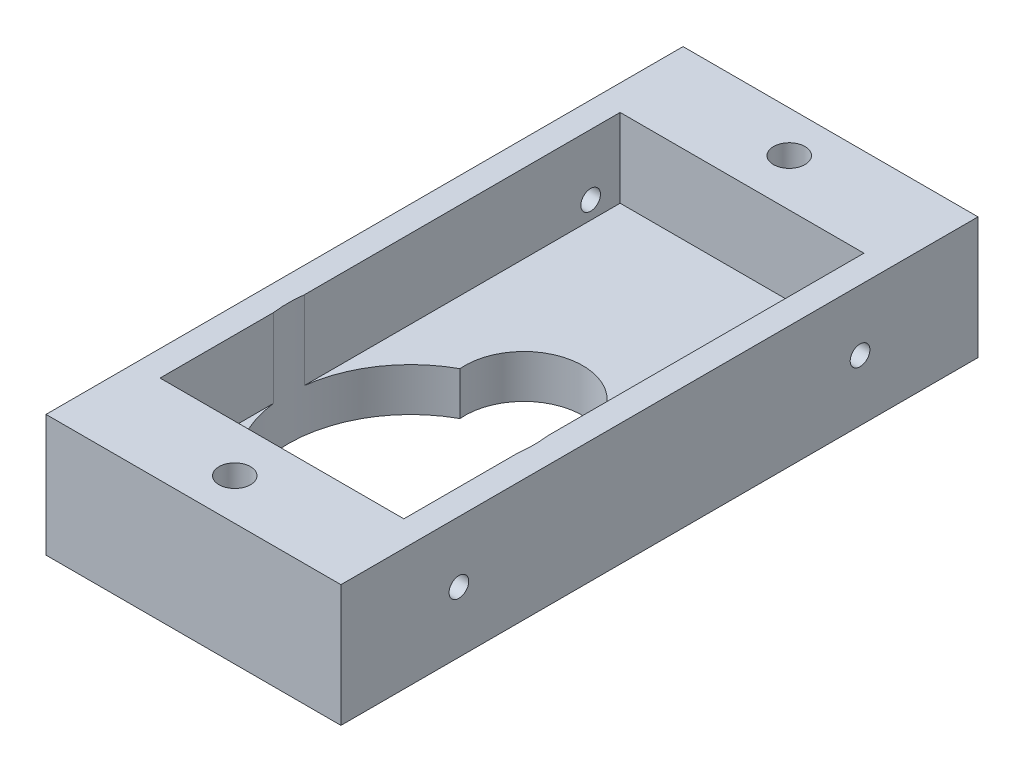
ISO-10303-21;
HEADER;
FILE_DESCRIPTION(('STEP AP214'),'2;1');
FILE_NAME('part.step','',(''),(''),'','','');
FILE_SCHEMA(('AUTOMOTIVE_DESIGN { 1 0 10303 214 1 1 1 1 }'));
ENDSEC;
DATA;
#1=APPLICATION_CONTEXT('core data for automotive mechanical design processes');
#2=APPLICATION_PROTOCOL_DEFINITION('international standard','automotive_design',2000,#1);
#3=PRODUCT_CONTEXT('',#1,'mechanical');
#4=PRODUCT('Part','Part','',(#3));
#5=PRODUCT_RELATED_PRODUCT_CATEGORY('part','',(#4));
#6=PRODUCT_DEFINITION_FORMATION('','',#4);
#7=PRODUCT_DEFINITION_CONTEXT('part definition',#1,'design');
#8=PRODUCT_DEFINITION('design','',#6,#7);
#9=PRODUCT_DEFINITION_SHAPE('','',#8);
#10=(LENGTH_UNIT() NAMED_UNIT(*) SI_UNIT(.MILLI.,.METRE.));
#11=(NAMED_UNIT(*) PLANE_ANGLE_UNIT() SI_UNIT($,.RADIAN.));
#12=(NAMED_UNIT(*) SI_UNIT($,.STERADIAN.) SOLID_ANGLE_UNIT());
#13=UNCERTAINTY_MEASURE_WITH_UNIT(LENGTH_MEASURE(1.E-05),#10,'distance_accuracy_value','');
#14=(GEOMETRIC_REPRESENTATION_CONTEXT(3) GLOBAL_UNCERTAINTY_ASSIGNED_CONTEXT((#13)) GLOBAL_UNIT_ASSIGNED_CONTEXT((#10,
#11,#12)) REPRESENTATION_CONTEXT('',''));
#15=CARTESIAN_POINT('',(0.,0.,0.));
#16=DIRECTION('',(0.,0.,1.));
#17=DIRECTION('',(1.,0.,0.));
#18=AXIS2_PLACEMENT_3D('',#15,#16,#17);
#19=CARTESIAN_POINT('',(0.,2.2,0.));
#20=DIRECTION('',(0.,-1.,0.));
#21=DIRECTION('',(0.,0.,-1.));
#22=AXIS2_PLACEMENT_3D('',#19,#20,#21);
#23=PLANE('',#22);
#24=CARTESIAN_POINT('',(7.5,2.2,21.35));
#25=DIRECTION('',(0.,1.,0.));
#26=DIRECTION('',(0.,0.,1.));
#27=AXIS2_PLACEMENT_3D('',#24,#25,#26);
#28=CIRCLE('',#27,6.25);
#29=CARTESIAN_POINT('',(13.7,2.2,20.561013308097));
#30=VERTEX_POINT('',#29);
#31=CARTESIAN_POINT('',(10.4886363227973,2.2,15.8608695652174));
#32=VERTEX_POINT('',#31);
#33=EDGE_CURVE('E295',#30,#32,#28,.T.);
#34=ORIENTED_EDGE('',*,*,#33,.F.);
#35=DIRECTION('',(0.,0.,-1.));
#36=VECTOR('',#35,1.);
#37=CARTESIAN_POINT('',(13.7,2.2,0.));
#38=LINE('',#37,#36);
#39=CARTESIAN_POINT('',(13.7,2.2,4.5));
#40=VERTEX_POINT('',#39);
#41=EDGE_CURVE('E234',#30,#40,#38,.T.);
#42=ORIENTED_EDGE('',*,*,#41,.T.);
#43=DIRECTION('',(-1.,0.,0.));
#44=VECTOR('',#43,1.);
#45=CARTESIAN_POINT('',(0.,2.2,4.50000000000001));
#46=LINE('',#45,#44);
#47=CARTESIAN_POINT('',(1.3,2.2,4.50000000000001));
#48=VERTEX_POINT('',#47);
#49=EDGE_CURVE('E265',#40,#48,#46,.T.);
#50=ORIENTED_EDGE('',*,*,#49,.T.);
#51=DIRECTION('',(0.,0.,1.));
#52=VECTOR('',#51,1.);
#53=CARTESIAN_POINT('',(1.3,2.2,0.));
#54=LINE('',#53,#52);
#55=CARTESIAN_POINT('',(1.3,2.2,20.561013308097));
#56=VERTEX_POINT('',#55);
#57=EDGE_CURVE('E264',#48,#56,#54,.T.);
#58=ORIENTED_EDGE('',*,*,#57,.T.);
#59=CARTESIAN_POINT('',(4.5113636772027,2.2,15.8608695652174));
#60=VERTEX_POINT('',#59);
#61=EDGE_CURVE('E291',#60,#56,#28,.T.);
#62=ORIENTED_EDGE('',*,*,#61,.F.);
#63=CARTESIAN_POINT('',(7.49999999999999,2.2,15.6));
#64=DIRECTION('',(0.,1.,0.));
#65=DIRECTION('',(0.,0.,1.));
#66=AXIS2_PLACEMENT_3D('',#63,#64,#65);
#67=CIRCLE('',#66,3.);
#68=EDGE_CURVE('E128',#32,#60,#67,.T.);
#69=ORIENTED_EDGE('',*,*,#68,.F.);
#70=EDGE_LOOP('',(#34,#42,#50,#58,#62,#69));
#71=FACE_BOUND('',#70,.T.);
#72=ADVANCED_FACE('F103',(#71),#23,.F.);
#73=DIRECTION('',(-1.,0.,0.));
#74=VECTOR('',#73,1.);
#75=CARTESIAN_POINT('',(0.,2.2,27.9));
#76=LINE('',#75,#74);
#77=CARTESIAN_POINT('',(13.7,2.2,27.9));
#78=VERTEX_POINT('',#77);
#79=CARTESIAN_POINT('',(1.3,2.2,27.9));
#80=VERTEX_POINT('',#79);
#81=EDGE_CURVE('E120',#78,#80,#76,.T.);
#82=ORIENTED_EDGE('',*,*,#81,.F.);
#83=CARTESIAN_POINT('',(13.7,2.2,22.138986691903));
#84=VERTEX_POINT('',#83);
#85=EDGE_CURVE('E231',#78,#84,#38,.T.);
#86=ORIENTED_EDGE('',*,*,#85,.T.);
#87=CARTESIAN_POINT('',(1.3,2.2,22.138986691903));
#88=VERTEX_POINT('',#87);
#89=EDGE_CURVE('E294',#88,#84,#28,.T.);
#90=ORIENTED_EDGE('',*,*,#89,.F.);
#91=EDGE_CURVE('E260',#88,#80,#54,.T.);
#92=ORIENTED_EDGE('',*,*,#91,.T.);
#93=EDGE_LOOP('',(#82,#86,#90,#92));
#94=FACE_BOUND('',#93,.T.);
#95=ADVANCED_FACE('F390',(#94),#23,.F.);
#96=CARTESIAN_POINT('',(0.,0.,0.));
#97=DIRECTION('',(0.,-1.,0.));
#98=DIRECTION('',(0.,0.,-1.));
#99=AXIS2_PLACEMENT_3D('',#96,#97,#98);
#100=PLANE('',#99);
#101=CARTESIAN_POINT('',(7.5,0.,21.35));
#102=DIRECTION('',(0.,1.,0.));
#103=DIRECTION('',(0.,0.,1.));
#104=AXIS2_PLACEMENT_3D('',#101,#102,#103);
#105=CIRCLE('',#104,6.25);
#106=CARTESIAN_POINT('',(4.5113636772027,0.,15.8608695652174));
#107=VERTEX_POINT('',#106);
#108=CARTESIAN_POINT('',(10.4886363227973,0.,15.8608695652174));
#109=VERTEX_POINT('',#108);
#110=EDGE_CURVE('E296',#107,#109,#105,.T.);
#111=ORIENTED_EDGE('',*,*,#110,.T.);
#112=CARTESIAN_POINT('',(7.49999999999999,0.,15.6));
#113=DIRECTION('',(0.,1.,0.));
#114=DIRECTION('',(0.,0.,1.));
#115=AXIS2_PLACEMENT_3D('',#112,#113,#114);
#116=CIRCLE('',#115,3.);
#117=EDGE_CURVE('E288',#109,#107,#116,.T.);
#118=ORIENTED_EDGE('',*,*,#117,.T.);
#119=EDGE_LOOP('',(#111,#118));
#120=FACE_BOUND('',#119,.T.);
#121=CARTESIAN_POINT('',(3.,0.,3.));
#122=DIRECTION('',(0.,1.,0.));
#123=DIRECTION('',(0.,0.,1.));
#124=AXIS2_PLACEMENT_3D('',#121,#122,#123);
#125=CIRCLE('',#124,0.8);
#126=CARTESIAN_POINT('',(3.,0.,3.8));
#127=VERTEX_POINT('',#126);
#128=EDGE_CURVE('E309',#127,#127,#125,.T.);
#129=ORIENTED_EDGE('',*,*,#128,.T.);
#130=EDGE_LOOP('',(#129));
#131=FACE_BOUND('',#130,.T.);
#132=CARTESIAN_POINT('',(12.,0.,29.4));
#133=DIRECTION('',(0.,1.,0.));
#134=DIRECTION('',(0.,0.,1.));
#135=AXIS2_PLACEMENT_3D('',#132,#133,#134);
#136=CIRCLE('',#135,0.8);
#137=CARTESIAN_POINT('',(12.,0.,30.2));
#138=VERTEX_POINT('',#137);
#139=EDGE_CURVE('E320',#138,#138,#136,.T.);
#140=ORIENTED_EDGE('',*,*,#139,.T.);
#141=EDGE_LOOP('',(#140));
#142=FACE_BOUND('',#141,.T.);
#143=DIRECTION('',(1.,0.,0.));
#144=VECTOR('',#143,1.);
#145=CARTESIAN_POINT('',(0.,0.,0.));
#146=LINE('',#145,#144);
#147=CARTESIAN_POINT('',(0.,0.,0.));
#148=VERTEX_POINT('',#147);
#149=CARTESIAN_POINT('',(15.,0.,0.));
#150=VERTEX_POINT('',#149);
#151=EDGE_CURVE('E325',#148,#150,#146,.T.);
#152=ORIENTED_EDGE('',*,*,#151,.T.);
#153=DIRECTION('',(0.,0.,1.));
#154=VECTOR('',#153,1.);
#155=CARTESIAN_POINT('',(15.,0.,0.));
#156=LINE('',#155,#154);
#157=CARTESIAN_POINT('',(15.,0.,32.4));
#158=VERTEX_POINT('',#157);
#159=EDGE_CURVE('E328',#150,#158,#156,.T.);
#160=ORIENTED_EDGE('',*,*,#159,.T.);
#161=DIRECTION('',(1.,0.,0.));
#162=VECTOR('',#161,1.);
#163=CARTESIAN_POINT('',(0.,0.,32.4));
#164=LINE('',#163,#162);
#165=CARTESIAN_POINT('',(0.,0.,32.4));
#166=VERTEX_POINT('',#165);
#167=EDGE_CURVE('E331',#166,#158,#164,.T.);
#168=ORIENTED_EDGE('',*,*,#167,.F.);
#169=DIRECTION('',(0.,0.,1.));
#170=VECTOR('',#169,1.);
#171=CARTESIAN_POINT('',(0.,0.,0.));
#172=LINE('',#171,#170);
#173=EDGE_CURVE('E212',#148,#166,#172,.T.);
#174=ORIENTED_EDGE('',*,*,#173,.F.);
#175=EDGE_LOOP('',(#152,#160,#168,#174));
#176=FACE_BOUND('',#175,.T.);
#177=CARTESIAN_POINT('',(3.,0.,29.4));
#178=DIRECTION('',(0.,1.,0.));
#179=DIRECTION('',(0.,0.,1.));
#180=AXIS2_PLACEMENT_3D('',#177,#178,#179);
#181=CIRCLE('',#180,0.799999999999999);
#182=CARTESIAN_POINT('',(3.,0.,30.2));
#183=VERTEX_POINT('',#182);
#184=EDGE_CURVE('E315',#183,#183,#181,.T.);
#185=ORIENTED_EDGE('',*,*,#184,.T.);
#186=EDGE_LOOP('',(#185));
#187=FACE_BOUND('',#186,.T.);
#188=CARTESIAN_POINT('',(12.,0.,3.));
#189=DIRECTION('',(0.,1.,0.));
#190=DIRECTION('',(0.,0.,1.));
#191=AXIS2_PLACEMENT_3D('',#188,#189,#190);
#192=CIRCLE('',#191,0.800000000000001);
#193=CARTESIAN_POINT('',(12.,0.,3.8));
#194=VERTEX_POINT('',#193);
#195=EDGE_CURVE('E303',#194,#194,#192,.T.);
#196=ORIENTED_EDGE('',*,*,#195,.T.);
#197=EDGE_LOOP('',(#196));
#198=FACE_BOUND('',#197,.T.);
#199=ADVANCED_FACE('F396',(#120,#131,#142,#176,#187,#198),#100,.T.);
#200=CARTESIAN_POINT('',(0.,2.2,0.));
#201=DIRECTION('',(0.,0.,-1.));
#202=DIRECTION('',(-1.,0.,0.));
#203=AXIS2_PLACEMENT_3D('',#200,#201,#202);
#204=PLANE('',#203);
#205=ORIENTED_EDGE('',*,*,#151,.F.);
#206=DIRECTION('',(0.,-1.,0.));
#207=VECTOR('',#206,1.);
#208=CARTESIAN_POINT('',(0.,2.2,0.));
#209=LINE('',#208,#207);
#210=CARTESIAN_POINT('',(0.,6.2,0.));
#211=VERTEX_POINT('',#210);
#212=EDGE_CURVE('E12',#211,#148,#209,.T.);
#213=ORIENTED_EDGE('',*,*,#212,.F.);
#214=DIRECTION('',(-1.,0.,0.));
#215=VECTOR('',#214,1.);
#216=CARTESIAN_POINT('',(0.,6.2,0.));
#217=LINE('',#216,#215);
#218=CARTESIAN_POINT('',(15.,6.2,0.));
#219=VERTEX_POINT('',#218);
#220=EDGE_CURVE('E230',#219,#211,#217,.T.);
#221=ORIENTED_EDGE('',*,*,#220,.F.);
#222=DIRECTION('',(0.,-1.,0.));
#223=VECTOR('',#222,1.);
#224=CARTESIAN_POINT('',(15.,2.2,0.));
#225=LINE('',#224,#223);
#226=EDGE_CURVE('E333',#219,#150,#225,.T.);
#227=ORIENTED_EDGE('',*,*,#226,.T.);
#228=EDGE_LOOP('',(#205,#213,#221,#227));
#229=FACE_BOUND('',#228,.T.);
#230=ADVANCED_FACE('F105',(#229),#204,.T.);
#231=CARTESIAN_POINT('',(0.,2.2,0.));
#232=DIRECTION('',(1.,0.,0.));
#233=DIRECTION('',(0.,0.,-1.));
#234=AXIS2_PLACEMENT_3D('',#231,#232,#233);
#235=PLANE('',#234);
#236=CARTESIAN_POINT('',(0.,3.1,26.4));
#237=DIRECTION('',(-1.,0.,0.));
#238=DIRECTION('',(0.,0.,1.));
#239=AXIS2_PLACEMENT_3D('',#236,#237,#238);
#240=CIRCLE('',#239,0.499999999999999);
#241=CARTESIAN_POINT('',(0.,3.1,26.9));
#242=VERTEX_POINT('',#241);
#243=EDGE_CURVE('E345',#242,#242,#240,.T.);
#244=ORIENTED_EDGE('',*,*,#243,.F.);
#245=EDGE_LOOP('',(#244));
#246=FACE_BOUND('',#245,.T.);
#247=CARTESIAN_POINT('',(0.,3.1,6.));
#248=DIRECTION('',(-1.,0.,0.));
#249=DIRECTION('',(0.,0.,1.));
#250=AXIS2_PLACEMENT_3D('',#247,#248,#249);
#251=CIRCLE('',#250,0.500000000000001);
#252=CARTESIAN_POINT('',(0.,3.1,6.5));
#253=VERTEX_POINT('',#252);
#254=EDGE_CURVE('E350',#253,#253,#251,.T.);
#255=ORIENTED_EDGE('',*,*,#254,.F.);
#256=EDGE_LOOP('',(#255));
#257=FACE_BOUND('',#256,.T.);
#258=ORIENTED_EDGE('',*,*,#173,.T.);
#259=DIRECTION('',(0.,-1.,0.));
#260=VECTOR('',#259,1.);
#261=CARTESIAN_POINT('',(0.,2.2,32.4));
#262=LINE('',#261,#260);
#263=CARTESIAN_POINT('',(0.,6.2,32.4));
#264=VERTEX_POINT('',#263);
#265=EDGE_CURVE('E112',#264,#166,#262,.T.);
#266=ORIENTED_EDGE('',*,*,#265,.F.);
#267=DIRECTION('',(0.,0.,1.));
#268=VECTOR('',#267,1.);
#269=CARTESIAN_POINT('',(0.,6.2,0.));
#270=LINE('',#269,#268);
#271=EDGE_CURVE('E210',#211,#264,#270,.T.);
#272=ORIENTED_EDGE('',*,*,#271,.F.);
#273=ORIENTED_EDGE('',*,*,#212,.T.);
#274=EDGE_LOOP('',(#258,#266,#272,#273));
#275=FACE_BOUND('',#274,.T.);
#276=ADVANCED_FACE('F208',(#246,#257,#275),#235,.F.);
#277=CARTESIAN_POINT('',(0.,2.2,32.4));
#278=DIRECTION('',(0.,0.,-1.));
#279=DIRECTION('',(-1.,0.,0.));
#280=AXIS2_PLACEMENT_3D('',#277,#278,#279);
#281=PLANE('',#280);
#282=ORIENTED_EDGE('',*,*,#167,.T.);
#283=DIRECTION('',(0.,-1.,0.));
#284=VECTOR('',#283,1.);
#285=CARTESIAN_POINT('',(15.,2.2,32.4));
#286=LINE('',#285,#284);
#287=CARTESIAN_POINT('',(15.,6.2,32.4));
#288=VERTEX_POINT('',#287);
#289=EDGE_CURVE('E216',#288,#158,#286,.T.);
#290=ORIENTED_EDGE('',*,*,#289,.F.);
#291=DIRECTION('',(1.,0.,0.));
#292=VECTOR('',#291,1.);
#293=CARTESIAN_POINT('',(0.,6.2,32.4));
#294=LINE('',#293,#292);
#295=EDGE_CURVE('E219',#264,#288,#294,.T.);
#296=ORIENTED_EDGE('',*,*,#295,.F.);
#297=ORIENTED_EDGE('',*,*,#265,.T.);
#298=EDGE_LOOP('',(#282,#290,#296,#297));
#299=FACE_BOUND('',#298,.T.);
#300=ADVANCED_FACE('F220',(#299),#281,.F.);
#301=CARTESIAN_POINT('',(15.,2.2,0.));
#302=DIRECTION('',(1.,0.,0.));
#303=DIRECTION('',(0.,0.,-1.));
#304=AXIS2_PLACEMENT_3D('',#301,#302,#303);
#305=PLANE('',#304);
#306=CARTESIAN_POINT('',(15.,3.1,26.4));
#307=DIRECTION('',(-1.,0.,0.));
#308=DIRECTION('',(0.,0.,1.));
#309=AXIS2_PLACEMENT_3D('',#306,#307,#308);
#310=CIRCLE('',#309,0.499999999999999);
#311=CARTESIAN_POINT('',(15.,3.1,26.9));
#312=VERTEX_POINT('',#311);
#313=EDGE_CURVE('E339',#312,#312,#310,.T.);
#314=ORIENTED_EDGE('',*,*,#313,.T.);
#315=EDGE_LOOP('',(#314));
#316=FACE_BOUND('',#315,.T.);
#317=CARTESIAN_POINT('',(15.,3.1,6.));
#318=DIRECTION('',(-1.,0.,0.));
#319=DIRECTION('',(0.,0.,1.));
#320=AXIS2_PLACEMENT_3D('',#317,#318,#319);
#321=CIRCLE('',#320,0.500000000000001);
#322=CARTESIAN_POINT('',(15.,3.1,6.5));
#323=VERTEX_POINT('',#322);
#324=EDGE_CURVE('E355',#323,#323,#321,.T.);
#325=ORIENTED_EDGE('',*,*,#324,.T.);
#326=EDGE_LOOP('',(#325));
#327=FACE_BOUND('',#326,.T.);
#328=ORIENTED_EDGE('',*,*,#159,.F.);
#329=ORIENTED_EDGE('',*,*,#226,.F.);
#330=DIRECTION('',(0.,0.,-1.));
#331=VECTOR('',#330,1.);
#332=CARTESIAN_POINT('',(15.,6.2,0.));
#333=LINE('',#332,#331);
#334=EDGE_CURVE('E224',#288,#219,#333,.T.);
#335=ORIENTED_EDGE('',*,*,#334,.F.);
#336=ORIENTED_EDGE('',*,*,#289,.T.);
#337=EDGE_LOOP('',(#328,#329,#335,#336));
#338=FACE_BOUND('',#337,.T.);
#339=ADVANCED_FACE('F410',(#316,#327,#338),#305,.T.);
#340=CARTESIAN_POINT('',(12.,2.2,29.4));
#341=DIRECTION('',(0.,-1.,0.));
#342=DIRECTION('',(0.,0.,-1.));
#343=AXIS2_PLACEMENT_3D('',#340,#341,#342);
#344=CYLINDRICAL_SURFACE('',#343,0.8);
#345=CARTESIAN_POINT('',(12.,2.2,29.4));
#346=DIRECTION('',(0.,1.,0.));
#347=DIRECTION('',(0.,0.,1.));
#348=AXIS2_PLACEMENT_3D('',#345,#346,#347);
#349=CIRCLE('',#348,0.8);
#350=CARTESIAN_POINT('',(12.,2.2,30.2));
#351=VERTEX_POINT('',#350);
#352=EDGE_CURVE('E299',#351,#351,#349,.T.);
#353=ORIENTED_EDGE('',*,*,#352,.T.);
#354=EDGE_LOOP('',(#353));
#355=FACE_BOUND('',#354,.T.);
#356=ORIENTED_EDGE('',*,*,#139,.F.);
#357=EDGE_LOOP('',(#356));
#358=FACE_BOUND('',#357,.T.);
#359=ADVANCED_FACE('F401',(#355,#358),#344,.F.);
#360=CARTESIAN_POINT('',(3.,2.2,29.4));
#361=DIRECTION('',(0.,-1.,0.));
#362=DIRECTION('',(0.,0.,-1.));
#363=AXIS2_PLACEMENT_3D('',#360,#361,#362);
#364=CYLINDRICAL_SURFACE('',#363,0.799999999999999);
#365=CARTESIAN_POINT('',(3.,2.2,29.4));
#366=DIRECTION('',(0.,1.,0.));
#367=DIRECTION('',(0.,0.,1.));
#368=AXIS2_PLACEMENT_3D('',#365,#366,#367);
#369=CIRCLE('',#368,0.799999999999999);
#370=CARTESIAN_POINT('',(3.,2.2,30.2));
#371=VERTEX_POINT('',#370);
#372=EDGE_CURVE('E312',#371,#371,#369,.T.);
#373=ORIENTED_EDGE('',*,*,#372,.T.);
#374=EDGE_LOOP('',(#373));
#375=FACE_BOUND('',#374,.T.);
#376=ORIENTED_EDGE('',*,*,#184,.F.);
#377=EDGE_LOOP('',(#376));
#378=FACE_BOUND('',#377,.T.);
#379=ADVANCED_FACE('F415',(#375,#378),#364,.F.);
#380=CARTESIAN_POINT('',(3.,2.2,3.));
#381=DIRECTION('',(0.,-1.,0.));
#382=DIRECTION('',(0.,0.,-1.));
#383=AXIS2_PLACEMENT_3D('',#380,#381,#382);
#384=CYLINDRICAL_SURFACE('',#383,0.8);
#385=CARTESIAN_POINT('',(3.,2.2,3.));
#386=DIRECTION('',(0.,1.,0.));
#387=DIRECTION('',(0.,0.,1.));
#388=AXIS2_PLACEMENT_3D('',#385,#386,#387);
#389=CIRCLE('',#388,0.8);
#390=CARTESIAN_POINT('',(3.,2.2,3.8));
#391=VERTEX_POINT('',#390);
#392=EDGE_CURVE('E306',#391,#391,#389,.T.);
#393=ORIENTED_EDGE('',*,*,#392,.T.);
#394=EDGE_LOOP('',(#393));
#395=FACE_BOUND('',#394,.T.);
#396=ORIENTED_EDGE('',*,*,#128,.F.);
#397=EDGE_LOOP('',(#396));
#398=FACE_BOUND('',#397,.T.);
#399=ADVANCED_FACE('F638',(#395,#398),#384,.F.);
#400=CARTESIAN_POINT('',(12.,2.2,3.));
#401=DIRECTION('',(0.,-1.,0.));
#402=DIRECTION('',(0.,0.,-1.));
#403=AXIS2_PLACEMENT_3D('',#400,#401,#402);
#404=CYLINDRICAL_SURFACE('',#403,0.800000000000001);
#405=CARTESIAN_POINT('',(12.,2.2,3.));
#406=DIRECTION('',(0.,1.,0.));
#407=DIRECTION('',(0.,0.,1.));
#408=AXIS2_PLACEMENT_3D('',#405,#406,#407);
#409=CIRCLE('',#408,0.800000000000001);
#410=CARTESIAN_POINT('',(12.,2.2,3.8));
#411=VERTEX_POINT('',#410);
#412=EDGE_CURVE('E285',#411,#411,#409,.T.);
#413=ORIENTED_EDGE('',*,*,#412,.T.);
#414=EDGE_LOOP('',(#413));
#415=FACE_BOUND('',#414,.T.);
#416=ORIENTED_EDGE('',*,*,#195,.F.);
#417=EDGE_LOOP('',(#416));
#418=FACE_BOUND('',#417,.T.);
#419=ADVANCED_FACE('F640',(#415,#418),#404,.F.);
#420=CARTESIAN_POINT('',(7.49999999999999,2.2,15.6));
#421=DIRECTION('',(0.,-1.,0.));
#422=DIRECTION('',(0.,0.,-1.));
#423=AXIS2_PLACEMENT_3D('',#420,#421,#422);
#424=CYLINDRICAL_SURFACE('',#423,3.);
#425=DIRECTION('',(0.,-1.,0.));
#426=VECTOR('',#425,1.);
#427=CARTESIAN_POINT('',(4.5113636772027,1.1,15.8608695652174));
#428=LINE('',#427,#426);
#429=EDGE_CURVE('E301',#60,#107,#428,.T.);
#430=ORIENTED_EDGE('',*,*,#429,.T.);
#431=ORIENTED_EDGE('',*,*,#117,.F.);
#432=DIRECTION('',(0.,-1.,0.));
#433=VECTOR('',#432,1.);
#434=CARTESIAN_POINT('',(10.4886363227973,1.1,15.8608695652174));
#435=LINE('',#434,#433);
#436=EDGE_CURVE('E287',#109,#32,#435,.F.);
#437=ORIENTED_EDGE('',*,*,#436,.T.);
#438=ORIENTED_EDGE('',*,*,#68,.T.);
#439=EDGE_LOOP('',(#430,#431,#437,#438));
#440=FACE_BOUND('',#439,.T.);
#441=ADVANCED_FACE('F452',(#440),#424,.F.);
#442=CARTESIAN_POINT('',(7.5,2.2,21.35));
#443=DIRECTION('',(0.,-1.,0.));
#444=DIRECTION('',(0.,0.,-1.));
#445=AXIS2_PLACEMENT_3D('',#442,#443,#444);
#446=CYLINDRICAL_SURFACE('',#445,6.25);
#447=ORIENTED_EDGE('',*,*,#61,.T.);
#448=DIRECTION('',(0.,-1.,0.));
#449=VECTOR('',#448,1.);
#450=CARTESIAN_POINT('',(1.3,6.2,20.561013308097));
#451=LINE('',#450,#449);
#452=CARTESIAN_POINT('',(1.3,6.2,20.561013308097));
#453=VERTEX_POINT('',#452);
#454=EDGE_CURVE('E279',#453,#56,#451,.T.);
#455=ORIENTED_EDGE('',*,*,#454,.F.);
#456=CARTESIAN_POINT('',(7.5,6.2,21.35));
#457=DIRECTION('',(0.,1.,0.));
#458=DIRECTION('',(0.,0.,1.));
#459=AXIS2_PLACEMENT_3D('',#456,#457,#458);
#460=CIRCLE('',#459,6.25);
#461=CARTESIAN_POINT('',(1.3,6.2,22.138986691903));
#462=VERTEX_POINT('',#461);
#463=EDGE_CURVE('E247',#462,#453,#460,.F.);
#464=ORIENTED_EDGE('',*,*,#463,.F.);
#465=DIRECTION('',(0.,-1.,0.));
#466=VECTOR('',#465,1.);
#467=CARTESIAN_POINT('',(1.3,6.2,22.138986691903));
#468=LINE('',#467,#466);
#469=EDGE_CURVE('E281',#462,#88,#468,.T.);
#470=ORIENTED_EDGE('',*,*,#469,.T.);
#471=ORIENTED_EDGE('',*,*,#89,.T.);
#472=DIRECTION('',(0.,-1.,0.));
#473=VECTOR('',#472,1.);
#474=CARTESIAN_POINT('',(13.7,6.2,22.138986691903));
#475=LINE('',#474,#473);
#476=CARTESIAN_POINT('',(13.7,6.2,22.138986691903));
#477=VERTEX_POINT('',#476);
#478=EDGE_CURVE('E271',#477,#84,#475,.T.);
#479=ORIENTED_EDGE('',*,*,#478,.F.);
#480=CARTESIAN_POINT('',(7.5,6.2,21.35));
#481=DIRECTION('',(0.,1.,0.));
#482=DIRECTION('',(0.,0.,1.));
#483=AXIS2_PLACEMENT_3D('',#480,#481,#482);
#484=CIRCLE('',#483,6.25);
#485=CARTESIAN_POINT('',(13.7,6.2,20.561013308097));
#486=VERTEX_POINT('',#485);
#487=EDGE_CURVE('E256',#486,#477,#484,.F.);
#488=ORIENTED_EDGE('',*,*,#487,.F.);
#489=DIRECTION('',(0.,-1.,0.));
#490=VECTOR('',#489,1.);
#491=CARTESIAN_POINT('',(13.7,6.2,20.561013308097));
#492=LINE('',#491,#490);
#493=EDGE_CURVE('E273',#486,#30,#492,.T.);
#494=ORIENTED_EDGE('',*,*,#493,.T.);
#495=ORIENTED_EDGE('',*,*,#33,.T.);
#496=ORIENTED_EDGE('',*,*,#436,.F.);
#497=ORIENTED_EDGE('',*,*,#110,.F.);
#498=ORIENTED_EDGE('',*,*,#429,.F.);
#499=EDGE_LOOP('',(#447,#455,#464,#470,#471,#479,#488,#494,#495,#496,#497,#498));
#500=FACE_BOUND('',#499,.T.);
#501=ADVANCED_FACE('F447',(#500),#446,.F.);
#502=CARTESIAN_POINT('',(0.,6.2,0.));
#503=DIRECTION('',(0.,1.,0.));
#504=DIRECTION('',(0.,0.,1.));
#505=AXIS2_PLACEMENT_3D('',#502,#503,#504);
#506=PLANE('',#505);
#507=CARTESIAN_POINT('',(7.50000000000002,6.2,2.1));
#508=DIRECTION('',(0.,1.,0.));
#509=DIRECTION('',(-1.,0.,0.));
#510=AXIS2_PLACEMENT_3D('',#507,#508,#509);
#511=CIRCLE('',#510,0.800000000000001);
#512=CARTESIAN_POINT('',(6.70000000000002,6.2,2.1));
#513=VERTEX_POINT('',#512);
#514=EDGE_CURVE('E363',#513,#513,#511,.T.);
#515=ORIENTED_EDGE('',*,*,#514,.F.);
#516=EDGE_LOOP('',(#515));
#517=FACE_BOUND('',#516,.T.);
#518=CARTESIAN_POINT('',(7.50000000000002,6.2,30.3));
#519=DIRECTION('',(0.,1.,0.));
#520=DIRECTION('',(-1.,0.,0.));
#521=AXIS2_PLACEMENT_3D('',#518,#519,#520);
#522=CIRCLE('',#521,0.8);
#523=CARTESIAN_POINT('',(6.70000000000002,6.2,30.3));
#524=VERTEX_POINT('',#523);
#525=EDGE_CURVE('E365',#524,#524,#522,.T.);
#526=ORIENTED_EDGE('',*,*,#525,.F.);
#527=EDGE_LOOP('',(#526));
#528=FACE_BOUND('',#527,.T.);
#529=ORIENTED_EDGE('',*,*,#271,.T.);
#530=ORIENTED_EDGE('',*,*,#295,.T.);
#531=ORIENTED_EDGE('',*,*,#334,.T.);
#532=ORIENTED_EDGE('',*,*,#220,.T.);
#533=EDGE_LOOP('',(#529,#530,#531,#532));
#534=FACE_BOUND('',#533,.T.);
#535=DIRECTION('',(-1.,0.,0.));
#536=VECTOR('',#535,1.);
#537=CARTESIAN_POINT('',(0.,6.2,27.9));
#538=LINE('',#537,#536);
#539=CARTESIAN_POINT('',(13.7,6.2,27.9));
#540=VERTEX_POINT('',#539);
#541=CARTESIAN_POINT('',(1.3,6.2,27.9));
#542=VERTEX_POINT('',#541);
#543=EDGE_CURVE('E242',#540,#542,#538,.T.);
#544=ORIENTED_EDGE('',*,*,#543,.T.);
#545=DIRECTION('',(0.,0.,1.));
#546=VECTOR('',#545,1.);
#547=CARTESIAN_POINT('',(1.3,6.2,0.));
#548=LINE('',#547,#546);
#549=EDGE_CURVE('E244',#462,#542,#548,.T.);
#550=ORIENTED_EDGE('',*,*,#549,.F.);
#551=ORIENTED_EDGE('',*,*,#463,.T.);
#552=CARTESIAN_POINT('',(1.3,6.2,4.50000000000001));
#553=VERTEX_POINT('',#552);
#554=EDGE_CURVE('E248',#553,#453,#548,.T.);
#555=ORIENTED_EDGE('',*,*,#554,.F.);
#556=DIRECTION('',(-1.,0.,0.));
#557=VECTOR('',#556,1.);
#558=CARTESIAN_POINT('',(0.,6.2,4.50000000000001));
#559=LINE('',#558,#557);
#560=CARTESIAN_POINT('',(13.7,6.2,4.5));
#561=VERTEX_POINT('',#560);
#562=EDGE_CURVE('E250',#561,#553,#559,.T.);
#563=ORIENTED_EDGE('',*,*,#562,.F.);
#564=DIRECTION('',(0.,0.,-1.));
#565=VECTOR('',#564,1.);
#566=CARTESIAN_POINT('',(13.7,6.2,0.));
#567=LINE('',#566,#565);
#568=EDGE_CURVE('E253',#486,#561,#567,.T.);
#569=ORIENTED_EDGE('',*,*,#568,.F.);
#570=ORIENTED_EDGE('',*,*,#487,.T.);
#571=EDGE_CURVE('E257',#540,#477,#567,.T.);
#572=ORIENTED_EDGE('',*,*,#571,.F.);
#573=EDGE_LOOP('',(#544,#550,#551,#555,#563,#569,#570,#572));
#574=FACE_BOUND('',#573,.T.);
#575=ADVANCED_FACE('F227',(#517,#528,#534,#574),#506,.T.);
#576=CARTESIAN_POINT('',(13.7,6.2,0.));
#577=DIRECTION('',(-1.,0.,0.));
#578=DIRECTION('',(0.,0.,1.));
#579=AXIS2_PLACEMENT_3D('',#576,#577,#578);
#580=PLANE('',#579);
#581=CARTESIAN_POINT('',(13.7,3.1,26.4));
#582=DIRECTION('',(-1.,0.,0.));
#583=DIRECTION('',(0.,0.,1.));
#584=AXIS2_PLACEMENT_3D('',#581,#582,#583);
#585=CIRCLE('',#584,0.499999999999999);
#586=CARTESIAN_POINT('',(13.7,3.1,26.9));
#587=VERTEX_POINT('',#586);
#588=EDGE_CURVE('E338',#587,#587,#585,.T.);
#589=ORIENTED_EDGE('',*,*,#588,.F.);
#590=EDGE_LOOP('',(#589));
#591=FACE_BOUND('',#590,.T.);
#592=ORIENTED_EDGE('',*,*,#85,.F.);
#593=DIRECTION('',(0.,-1.,0.));
#594=VECTOR('',#593,1.);
#595=CARTESIAN_POINT('',(13.7,6.2,27.9));
#596=LINE('',#595,#594);
#597=EDGE_CURVE('E269',#540,#78,#596,.T.);
#598=ORIENTED_EDGE('',*,*,#597,.F.);
#599=ORIENTED_EDGE('',*,*,#571,.T.);
#600=ORIENTED_EDGE('',*,*,#478,.T.);
#601=EDGE_LOOP('',(#592,#598,#599,#600));
#602=FACE_BOUND('',#601,.T.);
#603=ADVANCED_FACE('F532',(#591,#602),#580,.T.);
#604=CARTESIAN_POINT('',(13.7,3.1,6.));
#605=DIRECTION('',(-1.,0.,0.));
#606=DIRECTION('',(0.,0.,1.));
#607=AXIS2_PLACEMENT_3D('',#604,#605,#606);
#608=CIRCLE('',#607,0.500000000000001);
#609=CARTESIAN_POINT('',(13.7,3.1,6.5));
#610=VERTEX_POINT('',#609);
#611=EDGE_CURVE('E358',#610,#610,#608,.T.);
#612=ORIENTED_EDGE('',*,*,#611,.F.);
#613=EDGE_LOOP('',(#612));
#614=FACE_BOUND('',#613,.T.);
#615=ORIENTED_EDGE('',*,*,#41,.F.);
#616=ORIENTED_EDGE('',*,*,#493,.F.);
#617=ORIENTED_EDGE('',*,*,#568,.T.);
#618=DIRECTION('',(0.,-1.,0.));
#619=VECTOR('',#618,1.);
#620=CARTESIAN_POINT('',(13.7,6.2,4.5));
#621=LINE('',#620,#619);
#622=EDGE_CURVE('E275',#561,#40,#621,.T.);
#623=ORIENTED_EDGE('',*,*,#622,.T.);
#624=EDGE_LOOP('',(#615,#616,#617,#623));
#625=FACE_BOUND('',#624,.T.);
#626=ADVANCED_FACE('F468',(#614,#625),#580,.T.);
#627=CARTESIAN_POINT('',(0.,6.2,4.50000000000001));
#628=DIRECTION('',(0.,0.,1.));
#629=DIRECTION('',(1.,0.,0.));
#630=AXIS2_PLACEMENT_3D('',#627,#628,#629);
#631=PLANE('',#630);
#632=ORIENTED_EDGE('',*,*,#49,.F.);
#633=ORIENTED_EDGE('',*,*,#622,.F.);
#634=ORIENTED_EDGE('',*,*,#562,.T.);
#635=DIRECTION('',(0.,-1.,0.));
#636=VECTOR('',#635,1.);
#637=CARTESIAN_POINT('',(1.3,6.2,4.50000000000001));
#638=LINE('',#637,#636);
#639=EDGE_CURVE('E277',#553,#48,#638,.T.);
#640=ORIENTED_EDGE('',*,*,#639,.T.);
#641=EDGE_LOOP('',(#632,#633,#634,#640));
#642=FACE_BOUND('',#641,.T.);
#643=ADVANCED_FACE('F462',(#642),#631,.T.);
#644=CARTESIAN_POINT('',(1.3,6.2,0.));
#645=DIRECTION('',(1.,0.,0.));
#646=DIRECTION('',(0.,0.,-1.));
#647=AXIS2_PLACEMENT_3D('',#644,#645,#646);
#648=PLANE('',#647);
#649=CARTESIAN_POINT('',(1.3,3.1,6.));
#650=DIRECTION('',(1.,0.,0.));
#651=DIRECTION('',(0.,0.,-1.));
#652=AXIS2_PLACEMENT_3D('',#649,#650,#651);
#653=CIRCLE('',#652,0.500000000000001);
#654=CARTESIAN_POINT('',(1.3,3.1,5.5));
#655=VERTEX_POINT('',#654);
#656=EDGE_CURVE('E107',#655,#655,#653,.T.);
#657=ORIENTED_EDGE('',*,*,#656,.F.);
#658=EDGE_LOOP('',(#657));
#659=FACE_BOUND('',#658,.T.);
#660=ORIENTED_EDGE('',*,*,#57,.F.);
#661=ORIENTED_EDGE('',*,*,#639,.F.);
#662=ORIENTED_EDGE('',*,*,#554,.T.);
#663=ORIENTED_EDGE('',*,*,#454,.T.);
#664=EDGE_LOOP('',(#660,#661,#662,#663));
#665=FACE_BOUND('',#664,.T.);
#666=ADVANCED_FACE('F467',(#659,#665),#648,.T.);
#667=CARTESIAN_POINT('',(1.3,3.1,26.4));
#668=DIRECTION('',(1.,0.,0.));
#669=DIRECTION('',(0.,0.,-1.));
#670=AXIS2_PLACEMENT_3D('',#667,#668,#669);
#671=CIRCLE('',#670,0.499999999999999);
#672=CARTESIAN_POINT('',(1.3,3.1,25.9));
#673=VERTEX_POINT('',#672);
#674=EDGE_CURVE('E336',#673,#673,#671,.T.);
#675=ORIENTED_EDGE('',*,*,#674,.F.);
#676=EDGE_LOOP('',(#675));
#677=FACE_BOUND('',#676,.T.);
#678=ORIENTED_EDGE('',*,*,#91,.F.);
#679=ORIENTED_EDGE('',*,*,#469,.F.);
#680=ORIENTED_EDGE('',*,*,#549,.T.);
#681=DIRECTION('',(0.,-1.,0.));
#682=VECTOR('',#681,1.);
#683=CARTESIAN_POINT('',(1.3,6.2,27.9));
#684=LINE('',#683,#682);
#685=EDGE_CURVE('E283',#542,#80,#684,.T.);
#686=ORIENTED_EDGE('',*,*,#685,.T.);
#687=EDGE_LOOP('',(#678,#679,#680,#686));
#688=FACE_BOUND('',#687,.T.);
#689=ADVANCED_FACE('F483',(#677,#688),#648,.T.);
#690=CARTESIAN_POINT('',(0.,6.2,27.9));
#691=DIRECTION('',(0.,0.,1.));
#692=DIRECTION('',(1.,0.,0.));
#693=AXIS2_PLACEMENT_3D('',#690,#691,#692);
#694=PLANE('',#693);
#695=ORIENTED_EDGE('',*,*,#81,.T.);
#696=ORIENTED_EDGE('',*,*,#685,.F.);
#697=ORIENTED_EDGE('',*,*,#543,.F.);
#698=ORIENTED_EDGE('',*,*,#597,.T.);
#699=EDGE_LOOP('',(#695,#696,#697,#698));
#700=FACE_BOUND('',#699,.T.);
#701=ADVANCED_FACE('F478',(#700),#694,.F.);
#702=CARTESIAN_POINT('',(0.,2.2,0.));
#703=DIRECTION('',(0.,1.,0.));
#704=DIRECTION('',(0.,0.,1.));
#705=AXIS2_PLACEMENT_3D('',#702,#703,#704);
#706=PLANE('',#705);
#707=ORIENTED_EDGE('',*,*,#412,.F.);
#708=EDGE_LOOP('',(#707));
#709=FACE_BOUND('',#708,.T.);
#710=ADVANCED_FACE('F387',(#709),#706,.F.);
#711=ORIENTED_EDGE('',*,*,#392,.F.);
#712=EDGE_LOOP('',(#711));
#713=FACE_BOUND('',#712,.T.);
#714=ADVANCED_FACE('F495',(#713),#706,.F.);
#715=ORIENTED_EDGE('',*,*,#372,.F.);
#716=EDGE_LOOP('',(#715));
#717=FACE_BOUND('',#716,.T.);
#718=ADVANCED_FACE('F384',(#717),#706,.F.);
#719=ORIENTED_EDGE('',*,*,#352,.F.);
#720=EDGE_LOOP('',(#719));
#721=FACE_BOUND('',#720,.T.);
#722=ADVANCED_FACE('F376',(#721),#706,.F.);
#723=CARTESIAN_POINT('',(7.50000000000002,3.2,30.3));
#724=DIRECTION('',(0.,1.,0.));
#725=DIRECTION('',(-1.,0.,0.));
#726=AXIS2_PLACEMENT_3D('',#723,#724,#725);
#727=CYLINDRICAL_SURFACE('',#726,0.8);
#728=CARTESIAN_POINT('',(7.50000000000002,3.2,30.3));
#729=DIRECTION('',(0.,1.,0.));
#730=DIRECTION('',(-1.,0.,0.));
#731=AXIS2_PLACEMENT_3D('',#728,#729,#730);
#732=CIRCLE('',#731,0.8);
#733=CARTESIAN_POINT('',(6.70000000000002,3.2,30.3));
#734=VERTEX_POINT('',#733);
#735=EDGE_CURVE('E237',#734,#734,#732,.T.);
#736=ORIENTED_EDGE('',*,*,#735,.F.);
#737=EDGE_LOOP('',(#736));
#738=FACE_BOUND('',#737,.T.);
#739=ORIENTED_EDGE('',*,*,#525,.T.);
#740=EDGE_LOOP('',(#739));
#741=FACE_BOUND('',#740,.T.);
#742=ADVANCED_FACE('F374',(#738,#741),#727,.F.);
#743=CARTESIAN_POINT('',(7.50000000000002,3.2,30.3));
#744=DIRECTION('',(0.,1.,0.));
#745=DIRECTION('',(-1.,0.,0.));
#746=AXIS2_PLACEMENT_3D('',#743,#744,#745);
#747=PLANE('',#746);
#748=ORIENTED_EDGE('',*,*,#735,.T.);
#749=EDGE_LOOP('',(#748));
#750=FACE_BOUND('',#749,.T.);
#751=ADVANCED_FACE('F372',(#750),#747,.T.);
#752=CARTESIAN_POINT('',(7.50000000000002,3.2,2.1));
#753=DIRECTION('',(0.,1.,0.));
#754=DIRECTION('',(-1.,0.,0.));
#755=AXIS2_PLACEMENT_3D('',#752,#753,#754);
#756=CYLINDRICAL_SURFACE('',#755,0.800000000000001);
#757=CARTESIAN_POINT('',(7.50000000000002,3.2,2.1));
#758=DIRECTION('',(0.,1.,0.));
#759=DIRECTION('',(-1.,0.,0.));
#760=AXIS2_PLACEMENT_3D('',#757,#758,#759);
#761=CIRCLE('',#760,0.800000000000001);
#762=CARTESIAN_POINT('',(6.70000000000002,3.2,2.1));
#763=VERTEX_POINT('',#762);
#764=EDGE_CURVE('E261',#763,#763,#761,.T.);
#765=ORIENTED_EDGE('',*,*,#764,.F.);
#766=EDGE_LOOP('',(#765));
#767=FACE_BOUND('',#766,.T.);
#768=ORIENTED_EDGE('',*,*,#514,.T.);
#769=EDGE_LOOP('',(#768));
#770=FACE_BOUND('',#769,.T.);
#771=ADVANCED_FACE('F382',(#767,#770),#756,.F.);
#772=CARTESIAN_POINT('',(7.50000000000002,3.2,2.1));
#773=DIRECTION('',(0.,1.,0.));
#774=DIRECTION('',(-1.,0.,0.));
#775=AXIS2_PLACEMENT_3D('',#772,#773,#774);
#776=PLANE('',#775);
#777=ORIENTED_EDGE('',*,*,#764,.T.);
#778=EDGE_LOOP('',(#777));
#779=FACE_BOUND('',#778,.T.);
#780=ADVANCED_FACE('F554',(#779),#776,.T.);
#781=CARTESIAN_POINT('',(15.,3.1,26.4));
#782=DIRECTION('',(-1.,0.,0.));
#783=DIRECTION('',(0.,0.,1.));
#784=AXIS2_PLACEMENT_3D('',#781,#782,#783);
#785=CYLINDRICAL_SURFACE('',#784,0.499999999999999);
#786=ORIENTED_EDGE('',*,*,#674,.T.);
#787=EDGE_LOOP('',(#786));
#788=FACE_BOUND('',#787,.T.);
#789=ORIENTED_EDGE('',*,*,#243,.T.);
#790=EDGE_LOOP('',(#789));
#791=FACE_BOUND('',#790,.T.);
#792=ADVANCED_FACE('F562',(#788,#791),#785,.F.);
#793=CARTESIAN_POINT('',(15.,3.1,6.));
#794=DIRECTION('',(-1.,0.,0.));
#795=DIRECTION('',(0.,0.,1.));
#796=AXIS2_PLACEMENT_3D('',#793,#794,#795);
#797=CYLINDRICAL_SURFACE('',#796,0.500000000000001);
#798=ORIENTED_EDGE('',*,*,#656,.T.);
#799=EDGE_LOOP('',(#798));
#800=FACE_BOUND('',#799,.T.);
#801=ORIENTED_EDGE('',*,*,#254,.T.);
#802=EDGE_LOOP('',(#801));
#803=FACE_BOUND('',#802,.T.);
#804=ADVANCED_FACE('F573',(#800,#803),#797,.F.);
#805=ORIENTED_EDGE('',*,*,#611,.T.);
#806=EDGE_LOOP('',(#805));
#807=FACE_BOUND('',#806,.T.);
#808=ORIENTED_EDGE('',*,*,#324,.F.);
#809=EDGE_LOOP('',(#808));
#810=FACE_BOUND('',#809,.T.);
#811=ADVANCED_FACE('F581',(#807,#810),#797,.F.);
#812=ORIENTED_EDGE('',*,*,#588,.T.);
#813=EDGE_LOOP('',(#812));
#814=FACE_BOUND('',#813,.T.);
#815=ORIENTED_EDGE('',*,*,#313,.F.);
#816=EDGE_LOOP('',(#815));
#817=FACE_BOUND('',#816,.T.);
#818=ADVANCED_FACE('F575',(#814,#817),#785,.F.);
#819=CLOSED_SHELL('',(#72,#95,#199,#230,#276,#300,#339,#359,#379,#399,#419,#441,#501,#575,#603,
#626,#643,#666,#689,#701,#710,#714,#718,#722,#742,#751,#771,#780,#792,#804,#811,#818));
#820=MANIFOLD_SOLID_BREP('B2',#819);
#821=ADVANCED_BREP_SHAPE_REPRESENTATION('',(#18,#820),#14);
#822=SHAPE_DEFINITION_REPRESENTATION(#9,#821);
ENDSEC;
END-ISO-10303-21;
